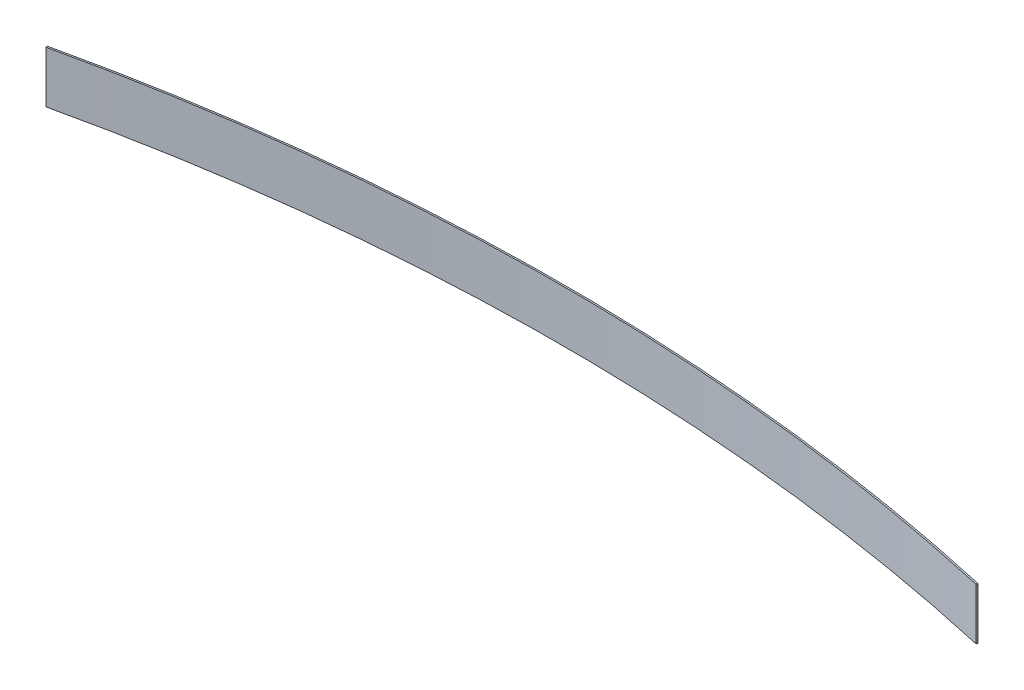
ISO-10303-21;
HEADER;
FILE_DESCRIPTION(('STEP AP214'),'2;1');
FILE_NAME('part.step','',(''),(''),'','','');
FILE_SCHEMA(('AUTOMOTIVE_DESIGN { 1 0 10303 214 1 1 1 1 }'));
ENDSEC;
DATA;
#1=APPLICATION_CONTEXT('core data for automotive mechanical design processes');
#2=APPLICATION_PROTOCOL_DEFINITION('international standard','automotive_design',2000,#1);
#3=PRODUCT_CONTEXT('',#1,'mechanical');
#4=PRODUCT('Part','Part','',(#3));
#5=PRODUCT_RELATED_PRODUCT_CATEGORY('part','',(#4));
#6=PRODUCT_DEFINITION_FORMATION('','',#4);
#7=PRODUCT_DEFINITION_CONTEXT('part definition',#1,'design');
#8=PRODUCT_DEFINITION('design','',#6,#7);
#9=PRODUCT_DEFINITION_SHAPE('','',#8);
#10=(LENGTH_UNIT() NAMED_UNIT(*) SI_UNIT(.MILLI.,.METRE.));
#11=(NAMED_UNIT(*) PLANE_ANGLE_UNIT() SI_UNIT($,.RADIAN.));
#12=(NAMED_UNIT(*) SI_UNIT($,.STERADIAN.) SOLID_ANGLE_UNIT());
#13=UNCERTAINTY_MEASURE_WITH_UNIT(LENGTH_MEASURE(1.E-05),#10,'distance_accuracy_value','');
#14=(GEOMETRIC_REPRESENTATION_CONTEXT(3) GLOBAL_UNCERTAINTY_ASSIGNED_CONTEXT((#13)) GLOBAL_UNIT_ASSIGNED_CONTEXT((#10,
#11,#12)) REPRESENTATION_CONTEXT('',''));
#15=CARTESIAN_POINT('',(0.,0.,0.));
#16=DIRECTION('',(0.,0.,1.));
#17=DIRECTION('',(1.,0.,0.));
#18=AXIS2_PLACEMENT_3D('',#15,#16,#17);
#19=CARTESIAN_POINT('',(914.400000000001,101.6,4064.00000000001));
#20=DIRECTION('',(0.,-1.,0.));
#21=DIRECTION('',(0.,0.,-1.));
#22=AXIS2_PLACEMENT_3D('',#19,#20,#21);
#23=CYLINDRICAL_SURFACE('',#22,4165.60000000001);
#24=CARTESIAN_POINT('',(914.400000000001,0.,4064.00000000001));
#25=DIRECTION('',(0.,-1.,0.));
#26=DIRECTION('',(0.,0.,-1.));
#27=AXIS2_PLACEMENT_3D('',#24,#25,#26);
#28=CIRCLE('',#27,4165.60000000001);
#29=CARTESIAN_POINT('',(0.,0.,0.));
#30=VERTEX_POINT('',#29);
#31=CARTESIAN_POINT('',(1828.8,0.,0.));
#32=VERTEX_POINT('',#31);
#33=EDGE_CURVE('E96',#30,#32,#28,.T.);
#34=ORIENTED_EDGE('',*,*,#33,.T.);
#35=DIRECTION('',(0.,-1.,0.));
#36=VECTOR('',#35,1.);
#37=CARTESIAN_POINT('',(1828.8,101.6,0.));
#38=LINE('',#37,#36);
#39=CARTESIAN_POINT('',(1828.8,101.6,0.));
#40=VERTEX_POINT('',#39);
#41=EDGE_CURVE('E11',#40,#32,#38,.T.);
#42=ORIENTED_EDGE('',*,*,#41,.F.);
#43=CARTESIAN_POINT('',(914.400000000001,101.6,4064.00000000001));
#44=DIRECTION('',(0.,-1.,0.));
#45=DIRECTION('',(0.,0.,-1.));
#46=AXIS2_PLACEMENT_3D('',#43,#44,#45);
#47=CIRCLE('',#46,4165.60000000001);
#48=CARTESIAN_POINT('',(0.,101.6,0.));
#49=VERTEX_POINT('',#48);
#50=EDGE_CURVE('E84',#49,#40,#47,.T.);
#51=ORIENTED_EDGE('',*,*,#50,.F.);
#52=DIRECTION('',(0.,-1.,0.));
#53=VECTOR('',#52,1.);
#54=CARTESIAN_POINT('',(0.,101.6,0.));
#55=LINE('',#54,#53);
#56=EDGE_CURVE('E92',#49,#30,#55,.T.);
#57=ORIENTED_EDGE('',*,*,#56,.T.);
#58=EDGE_LOOP('',(#34,#42,#51,#57));
#59=FACE_BOUND('',#58,.T.);
#60=ADVANCED_FACE('F33',(#59),#23,.F.);
#61=CARTESIAN_POINT('',(1829.49695121951,101.6,-3.09756097560943));
#62=DIRECTION('',(-0.975609756097564,0.,-0.219512195121938));
#63=DIRECTION('',(-0.219512195121938,0.,0.975609756097564));
#64=AXIS2_PLACEMENT_3D('',#61,#62,#63);
#65=PLANE('',#64);
#66=DIRECTION('',(0.219512195121938,0.,-0.975609756097564));
#67=VECTOR('',#66,1.);
#68=CARTESIAN_POINT('',(1829.49695121951,0.,-3.09756097560943));
#69=LINE('',#68,#67);
#70=CARTESIAN_POINT('',(1829.49695121951,0.,-3.09756097560943));
#71=VERTEX_POINT('',#70);
#72=EDGE_CURVE('E88',#32,#71,#69,.T.);
#73=ORIENTED_EDGE('',*,*,#72,.T.);
#74=DIRECTION('',(0.,-1.,0.));
#75=VECTOR('',#74,1.);
#76=CARTESIAN_POINT('',(1829.49695121951,101.6,-3.09756097560943));
#77=LINE('',#76,#75);
#78=CARTESIAN_POINT('',(1829.49695121951,101.6,-3.09756097560943));
#79=VERTEX_POINT('',#78);
#80=EDGE_CURVE('E41',#79,#71,#77,.T.);
#81=ORIENTED_EDGE('',*,*,#80,.F.);
#82=DIRECTION('',(0.219512195121938,0.,-0.975609756097564));
#83=VECTOR('',#82,1.);
#84=CARTESIAN_POINT('',(1829.49695121951,101.6,-3.09756097560943));
#85=LINE('',#84,#83);
#86=EDGE_CURVE('E79',#40,#79,#85,.T.);
#87=ORIENTED_EDGE('',*,*,#86,.F.);
#88=ORIENTED_EDGE('',*,*,#41,.T.);
#89=EDGE_LOOP('',(#73,#81,#87,#88));
#90=FACE_BOUND('',#89,.T.);
#91=ADVANCED_FACE('F87',(#90),#65,.F.);
#92=CARTESIAN_POINT('',(914.400000000001,101.6,4064.00000000001));
#93=DIRECTION('',(0.,-1.,0.));
#94=DIRECTION('',(0.,0.,-1.));
#95=AXIS2_PLACEMENT_3D('',#92,#93,#94);
#96=CYLINDRICAL_SURFACE('',#95,4168.77500000001);
#97=CARTESIAN_POINT('',(914.400000000001,0.,4064.00000000001));
#98=DIRECTION('',(0.,1.,0.));
#99=DIRECTION('',(0.,0.,-1.));
#100=AXIS2_PLACEMENT_3D('',#97,#98,#99);
#101=CIRCLE('',#100,4168.77500000001);
#102=CARTESIAN_POINT('',(-0.696951219511743,0.,-3.09756097560943));
#103=VERTEX_POINT('',#102);
#104=EDGE_CURVE('E66',#71,#103,#101,.T.);
#105=ORIENTED_EDGE('',*,*,#104,.T.);
#106=DIRECTION('',(0.,-1.,0.));
#107=VECTOR('',#106,1.);
#108=CARTESIAN_POINT('',(-0.696951219511743,101.6,-3.09756097560943));
#109=LINE('',#108,#107);
#110=CARTESIAN_POINT('',(-0.696951219511743,101.6,-3.09756097560943));
#111=VERTEX_POINT('',#110);
#112=EDGE_CURVE('E89',#111,#103,#109,.T.);
#113=ORIENTED_EDGE('',*,*,#112,.F.);
#114=CARTESIAN_POINT('',(914.400000000001,101.6,4064.00000000001));
#115=DIRECTION('',(0.,1.,0.));
#116=DIRECTION('',(0.,0.,-1.));
#117=AXIS2_PLACEMENT_3D('',#114,#115,#116);
#118=CIRCLE('',#117,4168.77500000001);
#119=EDGE_CURVE('E82',#79,#111,#118,.T.);
#120=ORIENTED_EDGE('',*,*,#119,.F.);
#121=ORIENTED_EDGE('',*,*,#80,.T.);
#122=EDGE_LOOP('',(#105,#113,#120,#121));
#123=FACE_BOUND('',#122,.T.);
#124=ADVANCED_FACE('F90',(#123),#96,.T.);
#125=CARTESIAN_POINT('',(-0.696951219511743,101.6,-3.09756097560943));
#126=DIRECTION('',(0.975609756097586,0.,-0.219512195121838));
#127=DIRECTION('',(-0.219512195121838,0.,-0.975609756097587));
#128=AXIS2_PLACEMENT_3D('',#125,#126,#127);
#129=PLANE('',#128);
#130=DIRECTION('',(0.219512195121838,0.,0.975609756097587));
#131=VECTOR('',#130,1.);
#132=CARTESIAN_POINT('',(-0.696951219511743,0.,-3.09756097560943));
#133=LINE('',#132,#131);
#134=EDGE_CURVE('E72',#103,#30,#133,.T.);
#135=ORIENTED_EDGE('',*,*,#134,.T.);
#136=ORIENTED_EDGE('',*,*,#56,.F.);
#137=DIRECTION('',(0.219512195121838,0.,0.975609756097587));
#138=VECTOR('',#137,1.);
#139=CARTESIAN_POINT('',(-0.696951219511743,101.6,-3.09756097560943));
#140=LINE('',#139,#138);
#141=EDGE_CURVE('E49',#111,#49,#140,.T.);
#142=ORIENTED_EDGE('',*,*,#141,.F.);
#143=ORIENTED_EDGE('',*,*,#112,.T.);
#144=EDGE_LOOP('',(#135,#136,#142,#143));
#145=FACE_BOUND('',#144,.T.);
#146=ADVANCED_FACE('F103',(#145),#129,.F.);
#147=CARTESIAN_POINT('',(914.400000000001,101.6,4064.00000000001));
#148=DIRECTION('',(0.,-1.,0.));
#149=DIRECTION('',(0.,0.,-1.));
#150=AXIS2_PLACEMENT_3D('',#147,#148,#149);
#151=PLANE('',#150);
#152=ORIENTED_EDGE('',*,*,#50,.T.);
#153=ORIENTED_EDGE('',*,*,#86,.T.);
#154=ORIENTED_EDGE('',*,*,#119,.T.);
#155=ORIENTED_EDGE('',*,*,#141,.T.);
#156=EDGE_LOOP('',(#152,#153,#154,#155));
#157=FACE_BOUND('',#156,.T.);
#158=ADVANCED_FACE('F80',(#157),#151,.F.);
#159=CARTESIAN_POINT('',(914.400000000001,0.,4064.00000000001));
#160=DIRECTION('',(0.,-1.,0.));
#161=DIRECTION('',(0.,0.,-1.));
#162=AXIS2_PLACEMENT_3D('',#159,#160,#161);
#163=PLANE('',#162);
#164=ORIENTED_EDGE('',*,*,#33,.F.);
#165=ORIENTED_EDGE('',*,*,#134,.F.);
#166=ORIENTED_EDGE('',*,*,#104,.F.);
#167=ORIENTED_EDGE('',*,*,#72,.F.);
#168=EDGE_LOOP('',(#164,#165,#166,#167));
#169=FACE_BOUND('',#168,.T.);
#170=ADVANCED_FACE('F106',(#169),#163,.T.);
#171=CLOSED_SHELL('',(#60,#91,#124,#146,#158,#170));
#172=MANIFOLD_SOLID_BREP('B2',#171);
#173=ADVANCED_BREP_SHAPE_REPRESENTATION('',(#18,#172),#14);
#174=SHAPE_DEFINITION_REPRESENTATION(#9,#173);
ENDSEC;
END-ISO-10303-21;
